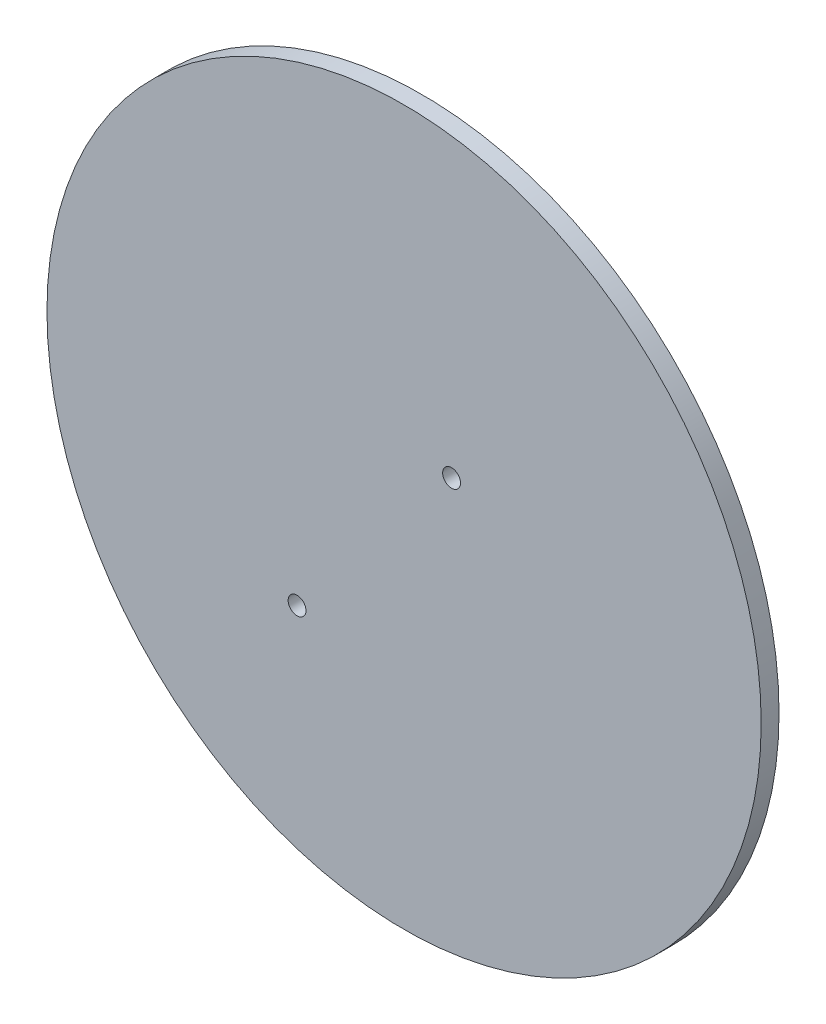
ISO-10303-21;
HEADER;
FILE_DESCRIPTION(('STEP AP214'),'2;1');
FILE_NAME('part.step','',(''),(''),'','','');
FILE_SCHEMA(('AUTOMOTIVE_DESIGN { 1 0 10303 214 1 1 1 1 }'));
ENDSEC;
DATA;
#1=APPLICATION_CONTEXT('core data for automotive mechanical design processes');
#2=APPLICATION_PROTOCOL_DEFINITION('international standard','automotive_design',2000,#1);
#3=PRODUCT_CONTEXT('',#1,'mechanical');
#4=PRODUCT('Part','Part','',(#3));
#5=PRODUCT_RELATED_PRODUCT_CATEGORY('part','',(#4));
#6=PRODUCT_DEFINITION_FORMATION('','',#4);
#7=PRODUCT_DEFINITION_CONTEXT('part definition',#1,'design');
#8=PRODUCT_DEFINITION('design','',#6,#7);
#9=PRODUCT_DEFINITION_SHAPE('','',#8);
#10=(LENGTH_UNIT() NAMED_UNIT(*) SI_UNIT(.MILLI.,.METRE.));
#11=(NAMED_UNIT(*) PLANE_ANGLE_UNIT() SI_UNIT($,.RADIAN.));
#12=(NAMED_UNIT(*) SI_UNIT($,.STERADIAN.) SOLID_ANGLE_UNIT());
#13=UNCERTAINTY_MEASURE_WITH_UNIT(LENGTH_MEASURE(1.E-05),#10,'distance_accuracy_value','');
#14=(GEOMETRIC_REPRESENTATION_CONTEXT(3) GLOBAL_UNCERTAINTY_ASSIGNED_CONTEXT((#13)) GLOBAL_UNIT_ASSIGNED_CONTEXT((#10,
#11,#12)) REPRESENTATION_CONTEXT('',''));
#15=CARTESIAN_POINT('',(0.,0.,0.));
#16=DIRECTION('',(0.,0.,1.));
#17=DIRECTION('',(1.,0.,0.));
#18=AXIS2_PLACEMENT_3D('',#15,#16,#17);
#19=CARTESIAN_POINT('',(0.,0.,2.));
#20=DIRECTION('',(0.,0.,1.));
#21=DIRECTION('',(1.,0.,0.));
#22=AXIS2_PLACEMENT_3D('',#19,#20,#21);
#23=PLANE('',#22);
#24=CARTESIAN_POINT('',(5.32206248939241,6.46655053788364,2.));
#25=DIRECTION('',(0.,0.,1.));
#26=DIRECTION('',(1.,0.,0.));
#27=AXIS2_PLACEMENT_3D('',#24,#25,#26);
#28=CIRCLE('',#27,1.);
#29=CARTESIAN_POINT('',(6.32206248939241,6.46655053788364,2.));
#30=VERTEX_POINT('',#29);
#31=EDGE_CURVE('E42',#30,#30,#28,.T.);
#32=ORIENTED_EDGE('',*,*,#31,.F.);
#33=EDGE_LOOP('',(#32));
#34=FACE_BOUND('',#33,.T.);
#35=CARTESIAN_POINT('',(0.,0.,2.));
#36=DIRECTION('',(0.,0.,1.));
#37=DIRECTION('',(1.,0.,0.));
#38=AXIS2_PLACEMENT_3D('',#35,#36,#37);
#39=CIRCLE('',#38,40.0242337068593);
#40=CARTESIAN_POINT('',(40.0242337068593,0.,2.));
#41=VERTEX_POINT('',#40);
#42=EDGE_CURVE('E10',#41,#41,#39,.T.);
#43=ORIENTED_EDGE('',*,*,#42,.T.);
#44=EDGE_LOOP('',(#43));
#45=FACE_BOUND('',#44,.T.);
#46=CARTESIAN_POINT('',(-11.9944990432574,-14.5738676301555,2.));
#47=DIRECTION('',(0.,0.,1.));
#48=DIRECTION('',(1.,0.,0.));
#49=AXIS2_PLACEMENT_3D('',#46,#47,#48);
#50=CIRCLE('',#49,1.);
#51=CARTESIAN_POINT('',(-10.9944990432574,-14.5738676301555,2.));
#52=VERTEX_POINT('',#51);
#53=EDGE_CURVE('E47',#52,#52,#50,.T.);
#54=ORIENTED_EDGE('',*,*,#53,.F.);
#55=EDGE_LOOP('',(#54));
#56=FACE_BOUND('',#55,.T.);
#57=ADVANCED_FACE('F31',(#34,#45,#56),#23,.T.);
#58=CARTESIAN_POINT('',(0.,0.,0.));
#59=DIRECTION('',(0.,0.,1.));
#60=DIRECTION('',(1.,0.,0.));
#61=AXIS2_PLACEMENT_3D('',#58,#59,#60);
#62=PLANE('',#61);
#63=CARTESIAN_POINT('',(5.32206248939241,6.46655053788364,0.));
#64=DIRECTION('',(0.,0.,1.));
#65=DIRECTION('',(1.,0.,0.));
#66=AXIS2_PLACEMENT_3D('',#63,#64,#65);
#67=CIRCLE('',#66,1.);
#68=CARTESIAN_POINT('',(6.32206248939241,6.46655053788364,0.));
#69=VERTEX_POINT('',#68);
#70=EDGE_CURVE('E44',#69,#69,#67,.T.);
#71=ORIENTED_EDGE('',*,*,#70,.T.);
#72=EDGE_LOOP('',(#71));
#73=FACE_BOUND('',#72,.T.);
#74=CARTESIAN_POINT('',(0.,0.,0.));
#75=DIRECTION('',(0.,0.,1.));
#76=DIRECTION('',(1.,0.,0.));
#77=AXIS2_PLACEMENT_3D('',#74,#75,#76);
#78=CIRCLE('',#77,40.0242337068593);
#79=CARTESIAN_POINT('',(40.0242337068593,0.,0.));
#80=VERTEX_POINT('',#79);
#81=EDGE_CURVE('E35',#80,#80,#78,.T.);
#82=ORIENTED_EDGE('',*,*,#81,.F.);
#83=EDGE_LOOP('',(#82));
#84=FACE_BOUND('',#83,.T.);
#85=CARTESIAN_POINT('',(-11.9944990432574,-14.5738676301555,0.));
#86=DIRECTION('',(0.,0.,1.));
#87=DIRECTION('',(1.,0.,0.));
#88=AXIS2_PLACEMENT_3D('',#85,#86,#87);
#89=CIRCLE('',#88,1.);
#90=CARTESIAN_POINT('',(-10.9944990432574,-14.5738676301555,0.));
#91=VERTEX_POINT('',#90);
#92=EDGE_CURVE('E50',#91,#91,#89,.T.);
#93=ORIENTED_EDGE('',*,*,#92,.T.);
#94=EDGE_LOOP('',(#93));
#95=FACE_BOUND('',#94,.T.);
#96=ADVANCED_FACE('F60',(#73,#84,#95),#62,.F.);
#97=CARTESIAN_POINT('',(0.,0.,2.));
#98=DIRECTION('',(0.,0.,-1.));
#99=DIRECTION('',(-1.,0.,0.));
#100=AXIS2_PLACEMENT_3D('',#97,#98,#99);
#101=CYLINDRICAL_SURFACE('',#100,40.0242337068593);
#102=ORIENTED_EDGE('',*,*,#42,.F.);
#103=EDGE_LOOP('',(#102));
#104=FACE_BOUND('',#103,.T.);
#105=ORIENTED_EDGE('',*,*,#81,.T.);
#106=EDGE_LOOP('',(#105));
#107=FACE_BOUND('',#106,.T.);
#108=ADVANCED_FACE('F33',(#104,#107),#101,.T.);
#109=CARTESIAN_POINT('',(5.32206248939241,6.46655053788364,2.));
#110=DIRECTION('',(0.,0.,-1.));
#111=DIRECTION('',(-1.,0.,0.));
#112=AXIS2_PLACEMENT_3D('',#109,#110,#111);
#113=CYLINDRICAL_SURFACE('',#112,1.);
#114=ORIENTED_EDGE('',*,*,#31,.T.);
#115=EDGE_LOOP('',(#114));
#116=FACE_BOUND('',#115,.T.);
#117=ORIENTED_EDGE('',*,*,#70,.F.);
#118=EDGE_LOOP('',(#117));
#119=FACE_BOUND('',#118,.T.);
#120=ADVANCED_FACE('F69',(#116,#119),#113,.F.);
#121=CARTESIAN_POINT('',(-11.9944990432574,-14.5738676301555,2.));
#122=DIRECTION('',(0.,0.,-1.));
#123=DIRECTION('',(-1.,0.,0.));
#124=AXIS2_PLACEMENT_3D('',#121,#122,#123);
#125=CYLINDRICAL_SURFACE('',#124,1.);
#126=ORIENTED_EDGE('',*,*,#53,.T.);
#127=EDGE_LOOP('',(#126));
#128=FACE_BOUND('',#127,.T.);
#129=ORIENTED_EDGE('',*,*,#92,.F.);
#130=EDGE_LOOP('',(#129));
#131=FACE_BOUND('',#130,.T.);
#132=ADVANCED_FACE('F56',(#128,#131),#125,.F.);
#133=CLOSED_SHELL('',(#57,#96,#108,#120,#132));
#134=MANIFOLD_SOLID_BREP('B2',#133);
#135=ADVANCED_BREP_SHAPE_REPRESENTATION('',(#18,#134),#14);
#136=SHAPE_DEFINITION_REPRESENTATION(#9,#135);
ENDSEC;
END-ISO-10303-21;
